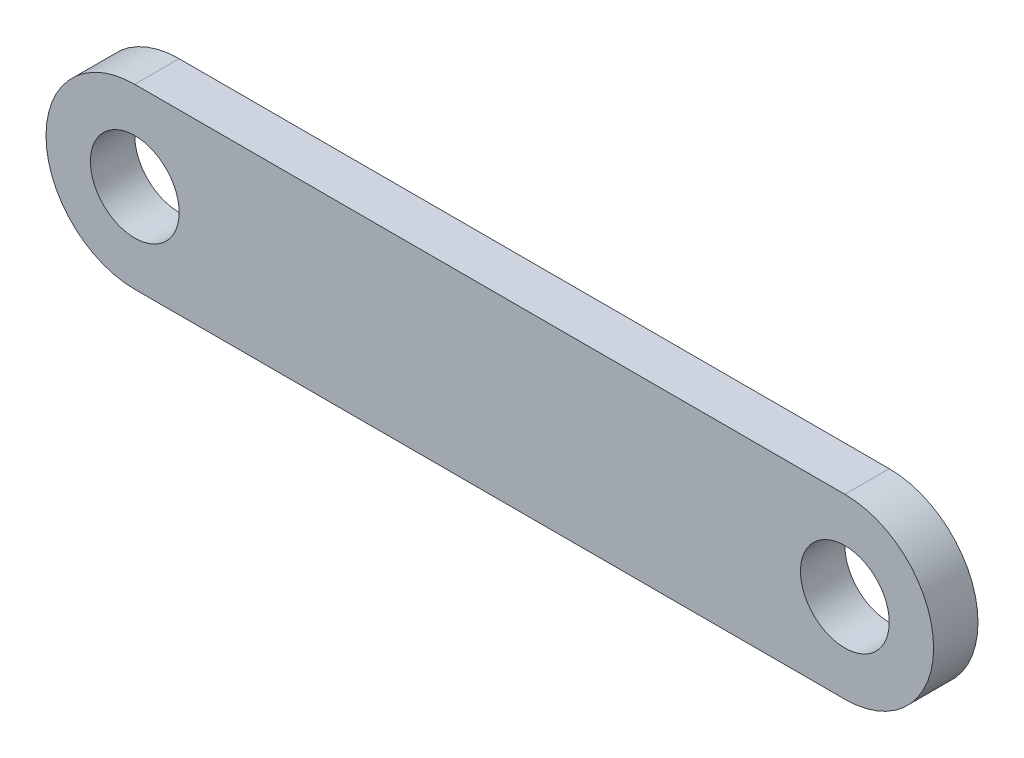
ISO-10303-21;
HEADER;
FILE_DESCRIPTION(('STEP AP214'),'2;1');
FILE_NAME('part.step','',(''),(''),'','','');
FILE_SCHEMA(('AUTOMOTIVE_DESIGN { 1 0 10303 214 1 1 1 1 }'));
ENDSEC;
DATA;
#1=APPLICATION_CONTEXT('core data for automotive mechanical design processes');
#2=APPLICATION_PROTOCOL_DEFINITION('international standard','automotive_design',2000,#1);
#3=PRODUCT_CONTEXT('',#1,'mechanical');
#4=PRODUCT('Part','Part','',(#3));
#5=PRODUCT_RELATED_PRODUCT_CATEGORY('part','',(#4));
#6=PRODUCT_DEFINITION_FORMATION('','',#4);
#7=PRODUCT_DEFINITION_CONTEXT('part definition',#1,'design');
#8=PRODUCT_DEFINITION('design','',#6,#7);
#9=PRODUCT_DEFINITION_SHAPE('','',#8);
#10=(LENGTH_UNIT() NAMED_UNIT(*) SI_UNIT(.MILLI.,.METRE.));
#11=(NAMED_UNIT(*) PLANE_ANGLE_UNIT() SI_UNIT($,.RADIAN.));
#12=(NAMED_UNIT(*) SI_UNIT($,.STERADIAN.) SOLID_ANGLE_UNIT());
#13=UNCERTAINTY_MEASURE_WITH_UNIT(LENGTH_MEASURE(1.E-05),#10,'distance_accuracy_value','');
#14=(GEOMETRIC_REPRESENTATION_CONTEXT(3) GLOBAL_UNCERTAINTY_ASSIGNED_CONTEXT((#13)) GLOBAL_UNIT_ASSIGNED_CONTEXT((#10,
#11,#12)) REPRESENTATION_CONTEXT('',''));
#15=CARTESIAN_POINT('',(0.,0.,0.));
#16=DIRECTION('',(0.,0.,1.));
#17=DIRECTION('',(1.,0.,0.));
#18=AXIS2_PLACEMENT_3D('',#15,#16,#17);
#19=CARTESIAN_POINT('',(-44.308348852459,27.0009495081967,10.));
#20=DIRECTION('',(0.,0.,1.));
#21=DIRECTION('',(1.,0.,0.));
#22=AXIS2_PLACEMENT_3D('',#19,#20,#21);
#23=PLANE('',#22);
#24=CARTESIAN_POINT('',(115.691651147541,27.0009495081967,10.));
#25=DIRECTION('',(0.,0.,1.));
#26=DIRECTION('',(1.,0.,0.));
#27=AXIS2_PLACEMENT_3D('',#24,#25,#26);
#28=CIRCLE('',#27,10.);
#29=CARTESIAN_POINT('',(125.691651147541,27.0009495081967,10.));
#30=VERTEX_POINT('',#29);
#31=EDGE_CURVE('E103',#30,#30,#28,.T.);
#32=ORIENTED_EDGE('',*,*,#31,.F.);
#33=EDGE_LOOP('',(#32));
#34=FACE_BOUND('',#33,.T.);
#35=CARTESIAN_POINT('',(-44.308348852459,27.0009495081967,10.));
#36=DIRECTION('',(0.,0.,1.));
#37=DIRECTION('',(1.,0.,0.));
#38=AXIS2_PLACEMENT_3D('',#35,#36,#37);
#39=CIRCLE('',#38,20.);
#40=CARTESIAN_POINT('',(-44.308348852459,47.0009495081967,10.));
#41=VERTEX_POINT('',#40);
#42=CARTESIAN_POINT('',(-44.308348852459,7.00094950819672,10.));
#43=VERTEX_POINT('',#42);
#44=EDGE_CURVE('E88',#41,#43,#39,.T.);
#45=ORIENTED_EDGE('',*,*,#44,.T.);
#46=DIRECTION('',(1.,0.,0.));
#47=VECTOR('',#46,1.);
#48=CARTESIAN_POINT('',(-44.308348852459,7.00094950819672,10.));
#49=LINE('',#48,#47);
#50=CARTESIAN_POINT('',(115.691651147541,7.00094950819671,10.));
#51=VERTEX_POINT('',#50);
#52=EDGE_CURVE('E83',#43,#51,#49,.T.);
#53=ORIENTED_EDGE('',*,*,#52,.T.);
#54=CARTESIAN_POINT('',(115.691651147541,27.0009495081967,10.));
#55=DIRECTION('',(0.,0.,1.));
#56=DIRECTION('',(1.,0.,0.));
#57=AXIS2_PLACEMENT_3D('',#54,#55,#56);
#58=CIRCLE('',#57,20.);
#59=CARTESIAN_POINT('',(115.691651147541,47.0009495081967,10.));
#60=VERTEX_POINT('',#59);
#61=EDGE_CURVE('E86',#51,#60,#58,.T.);
#62=ORIENTED_EDGE('',*,*,#61,.T.);
#63=DIRECTION('',(-1.,0.,0.));
#64=VECTOR('',#63,1.);
#65=CARTESIAN_POINT('',(-44.308348852459,47.0009495081967,10.));
#66=LINE('',#65,#64);
#67=EDGE_CURVE('E53',#60,#41,#66,.T.);
#68=ORIENTED_EDGE('',*,*,#67,.T.);
#69=EDGE_LOOP('',(#45,#53,#62,#68));
#70=FACE_BOUND('',#69,.T.);
#71=CARTESIAN_POINT('',(-44.308348852459,27.0009495081967,10.));
#72=DIRECTION('',(0.,0.,1.));
#73=DIRECTION('',(1.,0.,0.));
#74=AXIS2_PLACEMENT_3D('',#71,#72,#73);
#75=CIRCLE('',#74,10.);
#76=CARTESIAN_POINT('',(-34.308348852459,27.0009495081967,10.));
#77=VERTEX_POINT('',#76);
#78=EDGE_CURVE('E118',#77,#77,#75,.T.);
#79=ORIENTED_EDGE('',*,*,#78,.F.);
#80=EDGE_LOOP('',(#79));
#81=FACE_BOUND('',#80,.T.);
#82=ADVANCED_FACE('F36',(#34,#70,#81),#23,.T.);
#83=CARTESIAN_POINT('',(-44.308348852459,27.0009495081967,0.));
#84=DIRECTION('',(0.,0.,1.));
#85=DIRECTION('',(1.,0.,0.));
#86=AXIS2_PLACEMENT_3D('',#83,#84,#85);
#87=PLANE('',#86);
#88=CARTESIAN_POINT('',(-44.308348852459,27.0009495081967,0.));
#89=DIRECTION('',(0.,0.,1.));
#90=DIRECTION('',(1.,0.,0.));
#91=AXIS2_PLACEMENT_3D('',#88,#89,#90);
#92=CIRCLE('',#91,20.);
#93=CARTESIAN_POINT('',(-44.308348852459,47.0009495081967,0.));
#94=VERTEX_POINT('',#93);
#95=CARTESIAN_POINT('',(-44.308348852459,7.00094950819672,0.));
#96=VERTEX_POINT('',#95);
#97=EDGE_CURVE('E100',#94,#96,#92,.T.);
#98=ORIENTED_EDGE('',*,*,#97,.F.);
#99=DIRECTION('',(-1.,0.,0.));
#100=VECTOR('',#99,1.);
#101=CARTESIAN_POINT('',(-44.308348852459,47.0009495081967,0.));
#102=LINE('',#101,#100);
#103=CARTESIAN_POINT('',(115.691651147541,47.0009495081967,0.));
#104=VERTEX_POINT('',#103);
#105=EDGE_CURVE('E76',#104,#94,#102,.T.);
#106=ORIENTED_EDGE('',*,*,#105,.F.);
#107=CARTESIAN_POINT('',(115.691651147541,27.0009495081967,0.));
#108=DIRECTION('',(0.,0.,1.));
#109=DIRECTION('',(1.,0.,0.));
#110=AXIS2_PLACEMENT_3D('',#107,#108,#109);
#111=CIRCLE('',#110,20.);
#112=CARTESIAN_POINT('',(115.691651147541,7.00094950819671,0.));
#113=VERTEX_POINT('',#112);
#114=EDGE_CURVE('E70',#113,#104,#111,.T.);
#115=ORIENTED_EDGE('',*,*,#114,.F.);
#116=DIRECTION('',(1.,0.,0.));
#117=VECTOR('',#116,1.);
#118=CARTESIAN_POINT('',(-44.308348852459,7.00094950819672,0.));
#119=LINE('',#118,#117);
#120=EDGE_CURVE('E92',#96,#113,#119,.T.);
#121=ORIENTED_EDGE('',*,*,#120,.F.);
#122=EDGE_LOOP('',(#98,#106,#115,#121));
#123=FACE_BOUND('',#122,.T.);
#124=CARTESIAN_POINT('',(115.691651147541,27.0009495081967,0.));
#125=DIRECTION('',(0.,0.,1.));
#126=DIRECTION('',(1.,0.,0.));
#127=AXIS2_PLACEMENT_3D('',#124,#125,#126);
#128=CIRCLE('',#127,10.);
#129=CARTESIAN_POINT('',(125.691651147541,27.0009495081967,0.));
#130=VERTEX_POINT('',#129);
#131=EDGE_CURVE('E115',#130,#130,#128,.T.);
#132=ORIENTED_EDGE('',*,*,#131,.T.);
#133=EDGE_LOOP('',(#132));
#134=FACE_BOUND('',#133,.T.);
#135=CARTESIAN_POINT('',(-44.308348852459,27.0009495081967,0.));
#136=DIRECTION('',(0.,0.,1.));
#137=DIRECTION('',(1.,0.,0.));
#138=AXIS2_PLACEMENT_3D('',#135,#136,#137);
#139=CIRCLE('',#138,10.);
#140=CARTESIAN_POINT('',(-34.308348852459,27.0009495081967,0.));
#141=VERTEX_POINT('',#140);
#142=EDGE_CURVE('E121',#141,#141,#139,.T.);
#143=ORIENTED_EDGE('',*,*,#142,.T.);
#144=EDGE_LOOP('',(#143));
#145=FACE_BOUND('',#144,.T.);
#146=ADVANCED_FACE('F111',(#123,#134,#145),#87,.F.);
#147=CARTESIAN_POINT('',(-44.308348852459,27.0009495081967,10.));
#148=DIRECTION('',(0.,0.,-1.));
#149=DIRECTION('',(-1.,0.,0.));
#150=AXIS2_PLACEMENT_3D('',#147,#148,#149);
#151=CYLINDRICAL_SURFACE('',#150,20.);
#152=ORIENTED_EDGE('',*,*,#97,.T.);
#153=DIRECTION('',(0.,0.,-1.));
#154=VECTOR('',#153,1.);
#155=CARTESIAN_POINT('',(-44.308348852459,7.00094950819672,10.));
#156=LINE('',#155,#154);
#157=EDGE_CURVE('E11',#43,#96,#156,.T.);
#158=ORIENTED_EDGE('',*,*,#157,.F.);
#159=ORIENTED_EDGE('',*,*,#44,.F.);
#160=DIRECTION('',(0.,0.,-1.));
#161=VECTOR('',#160,1.);
#162=CARTESIAN_POINT('',(-44.308348852459,47.0009495081967,10.));
#163=LINE('',#162,#161);
#164=EDGE_CURVE('E96',#41,#94,#163,.T.);
#165=ORIENTED_EDGE('',*,*,#164,.T.);
#166=EDGE_LOOP('',(#152,#158,#159,#165));
#167=FACE_BOUND('',#166,.T.);
#168=ADVANCED_FACE('F38',(#167),#151,.T.);
#169=CARTESIAN_POINT('',(-44.308348852459,7.00094950819672,10.));
#170=DIRECTION('',(0.,1.,0.));
#171=DIRECTION('',(-1.,0.,0.));
#172=AXIS2_PLACEMENT_3D('',#169,#170,#171);
#173=PLANE('',#172);
#174=ORIENTED_EDGE('',*,*,#120,.T.);
#175=DIRECTION('',(0.,0.,-1.));
#176=VECTOR('',#175,1.);
#177=CARTESIAN_POINT('',(115.691651147541,7.00094950819671,10.));
#178=LINE('',#177,#176);
#179=EDGE_CURVE('E45',#51,#113,#178,.T.);
#180=ORIENTED_EDGE('',*,*,#179,.F.);
#181=ORIENTED_EDGE('',*,*,#52,.F.);
#182=ORIENTED_EDGE('',*,*,#157,.T.);
#183=EDGE_LOOP('',(#174,#180,#181,#182));
#184=FACE_BOUND('',#183,.T.);
#185=ADVANCED_FACE('F91',(#184),#173,.F.);
#186=CARTESIAN_POINT('',(115.691651147541,27.0009495081967,10.));
#187=DIRECTION('',(0.,0.,-1.));
#188=DIRECTION('',(-1.,0.,0.));
#189=AXIS2_PLACEMENT_3D('',#186,#187,#188);
#190=CYLINDRICAL_SURFACE('',#189,20.);
#191=ORIENTED_EDGE('',*,*,#114,.T.);
#192=DIRECTION('',(0.,0.,-1.));
#193=VECTOR('',#192,1.);
#194=CARTESIAN_POINT('',(115.691651147541,47.0009495081967,10.));
#195=LINE('',#194,#193);
#196=EDGE_CURVE('E93',#60,#104,#195,.T.);
#197=ORIENTED_EDGE('',*,*,#196,.F.);
#198=ORIENTED_EDGE('',*,*,#61,.F.);
#199=ORIENTED_EDGE('',*,*,#179,.T.);
#200=EDGE_LOOP('',(#191,#197,#198,#199));
#201=FACE_BOUND('',#200,.T.);
#202=ADVANCED_FACE('F94',(#201),#190,.T.);
#203=CARTESIAN_POINT('',(-44.308348852459,47.0009495081967,10.));
#204=DIRECTION('',(0.,-1.,0.));
#205=DIRECTION('',(0.,0.,-1.));
#206=AXIS2_PLACEMENT_3D('',#203,#204,#205);
#207=PLANE('',#206);
#208=ORIENTED_EDGE('',*,*,#105,.T.);
#209=ORIENTED_EDGE('',*,*,#164,.F.);
#210=ORIENTED_EDGE('',*,*,#67,.F.);
#211=ORIENTED_EDGE('',*,*,#196,.T.);
#212=EDGE_LOOP('',(#208,#209,#210,#211));
#213=FACE_BOUND('',#212,.T.);
#214=ADVANCED_FACE('F108',(#213),#207,.F.);
#215=CARTESIAN_POINT('',(115.691651147541,27.0009495081967,10.));
#216=DIRECTION('',(0.,0.,-1.));
#217=DIRECTION('',(-1.,0.,0.));
#218=AXIS2_PLACEMENT_3D('',#215,#216,#217);
#219=CYLINDRICAL_SURFACE('',#218,10.);
#220=ORIENTED_EDGE('',*,*,#31,.T.);
#221=EDGE_LOOP('',(#220));
#222=FACE_BOUND('',#221,.T.);
#223=ORIENTED_EDGE('',*,*,#131,.F.);
#224=EDGE_LOOP('',(#223));
#225=FACE_BOUND('',#224,.T.);
#226=ADVANCED_FACE('F138',(#222,#225),#219,.F.);
#227=CARTESIAN_POINT('',(-44.308348852459,27.0009495081967,10.));
#228=DIRECTION('',(0.,0.,-1.));
#229=DIRECTION('',(-1.,0.,0.));
#230=AXIS2_PLACEMENT_3D('',#227,#228,#229);
#231=CYLINDRICAL_SURFACE('',#230,10.);
#232=ORIENTED_EDGE('',*,*,#78,.T.);
#233=EDGE_LOOP('',(#232));
#234=FACE_BOUND('',#233,.T.);
#235=ORIENTED_EDGE('',*,*,#142,.F.);
#236=EDGE_LOOP('',(#235));
#237=FACE_BOUND('',#236,.T.);
#238=ADVANCED_FACE('F127',(#234,#237),#231,.F.);
#239=CLOSED_SHELL('',(#82,#146,#168,#185,#202,#214,#226,#238));
#240=MANIFOLD_SOLID_BREP('B2',#239);
#241=ADVANCED_BREP_SHAPE_REPRESENTATION('',(#18,#240),#14);
#242=SHAPE_DEFINITION_REPRESENTATION(#9,#241);
ENDSEC;
END-ISO-10303-21;
